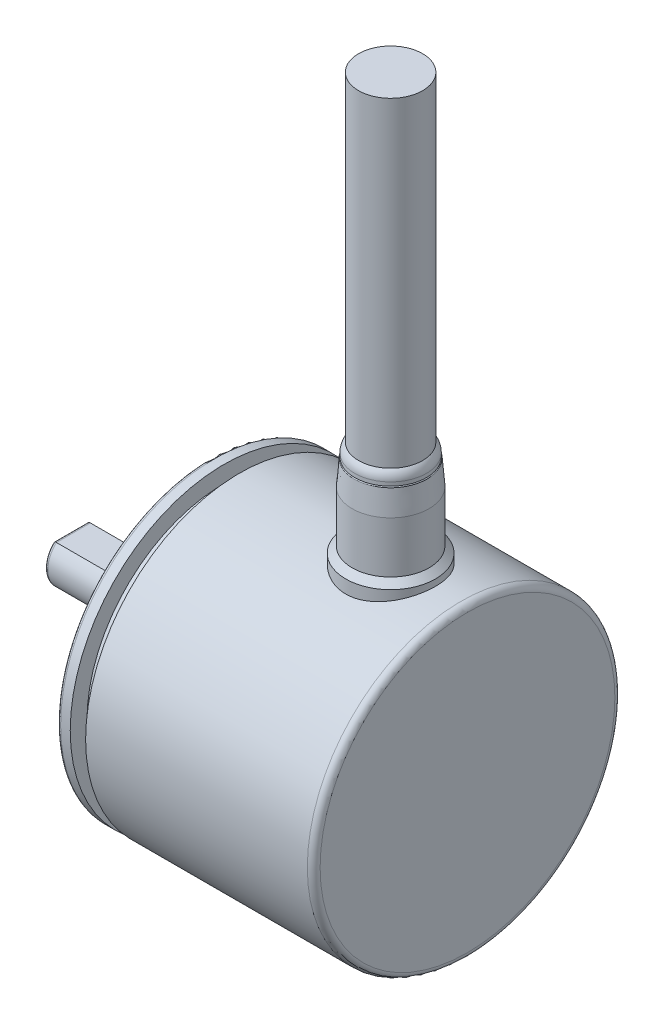
ISO-10303-21;
HEADER;
FILE_DESCRIPTION(('STEP AP214'),'2;1');
FILE_NAME('part.step','',(''),(''),'','','');
FILE_SCHEMA(('AUTOMOTIVE_DESIGN { 1 0 10303 214 1 1 1 1 }'));
ENDSEC;
DATA;
#1=APPLICATION_CONTEXT('core data for automotive mechanical design processes');
#2=APPLICATION_PROTOCOL_DEFINITION('international standard','automotive_design',2000,#1);
#3=PRODUCT_CONTEXT('',#1,'mechanical');
#4=PRODUCT('Part','Part','',(#3));
#5=PRODUCT_RELATED_PRODUCT_CATEGORY('part','',(#4));
#6=PRODUCT_DEFINITION_FORMATION('','',#4);
#7=PRODUCT_DEFINITION_CONTEXT('part definition',#1,'design');
#8=PRODUCT_DEFINITION('design','',#6,#7);
#9=PRODUCT_DEFINITION_SHAPE('','',#8);
#10=(LENGTH_UNIT() NAMED_UNIT(*) SI_UNIT(.MILLI.,.METRE.));
#11=(NAMED_UNIT(*) PLANE_ANGLE_UNIT() SI_UNIT($,.RADIAN.));
#12=(NAMED_UNIT(*) SI_UNIT($,.STERADIAN.) SOLID_ANGLE_UNIT());
#13=UNCERTAINTY_MEASURE_WITH_UNIT(LENGTH_MEASURE(1.E-05),#10,'distance_accuracy_value','');
#14=(GEOMETRIC_REPRESENTATION_CONTEXT(3) GLOBAL_UNCERTAINTY_ASSIGNED_CONTEXT((#13)) GLOBAL_UNIT_ASSIGNED_CONTEXT((#10,
#11,#12)) REPRESENTATION_CONTEXT('',''));
#15=CARTESIAN_POINT('',(0.,0.,0.));
#16=DIRECTION('',(0.,0.,1.));
#17=DIRECTION('',(1.,0.,0.));
#18=AXIS2_PLACEMENT_3D('',#15,#16,#17);
#19=CARTESIAN_POINT('',(0.,0.,0.));
#20=DIRECTION('',(-1.,0.,0.));
#21=DIRECTION('',(0.,0.,1.));
#22=AXIS2_PLACEMENT_3D('',#19,#20,#21);
#23=CYLINDRICAL_SURFACE('',#22,12.);
#24=CARTESIAN_POINT('',(30.5,0.,0.));
#25=DIRECTION('',(-1.,0.,0.));
#26=DIRECTION('',(0.,0.,1.));
#27=AXIS2_PLACEMENT_3D('',#24,#25,#26);
#28=CIRCLE('',#27,12.);
#29=CARTESIAN_POINT('',(30.5,0.,12.));
#30=VERTEX_POINT('',#29);
#31=EDGE_CURVE('E166',#30,#30,#28,.T.);
#32=ORIENTED_EDGE('',*,*,#31,.T.);
#33=EDGE_LOOP('',(#32));
#34=FACE_BOUND('',#33,.T.);
#35=CARTESIAN_POINT('',(13.2,0.,0.));
#36=DIRECTION('',(-1.,0.,0.));
#37=DIRECTION('',(0.,0.,1.));
#38=AXIS2_PLACEMENT_3D('',#35,#36,#37);
#39=CIRCLE('',#38,12.);
#40=CARTESIAN_POINT('',(13.2,0.,12.));
#41=VERTEX_POINT('',#40);
#42=EDGE_CURVE('E110',#41,#41,#39,.T.);
#43=ORIENTED_EDGE('',*,*,#42,.F.);
#44=EDGE_LOOP('',(#43));
#45=FACE_BOUND('',#44,.T.);
#46=CARTESIAN_POINT('',(25.,11.478240283249,-3.5));
#47=CARTESIAN_POINT('',(24.8079456800867,11.4782427046884,-3.49999696286623));
#48=CARTESIAN_POINT('',(24.6158610111039,11.4831132136885,-3.48413840403905));
#49=CARTESIAN_POINT('',(24.2372896890593,11.5019963851738,-3.42127517544508));
#50=CARTESIAN_POINT('',(24.0508051718023,11.5160124904586,-3.37425877640989));
#51=CARTESIAN_POINT('',(23.6889680345196,11.55146732875,-3.25079782037676));
#52=CARTESIAN_POINT('',(23.5135981716306,11.5728942140006,-3.17440021398415));
#53=CARTESIAN_POINT('',(23.1781252420887,11.6207405585869,-2.99449806960499));
#54=CARTESIAN_POINT('',(23.018024188889,11.6471606749995,-2.89098996336001));
#55=CARTESIAN_POINT('',(22.7128447188661,11.7029027600059,-2.65649108658758));
#56=CARTESIAN_POINT('',(22.5682905827767,11.7322839400002,-2.52483193403778));
#57=CARTESIAN_POINT('',(22.3029687593823,11.7901304923972,-2.23920199384477));
#58=CARTESIAN_POINT('',(22.1822039671813,11.8185957529825,-2.08522849455368));
#59=CARTESIAN_POINT('',(21.9656359047095,11.8720727241446,-1.75563543194072));
#60=CARTESIAN_POINT('',(21.8703637304491,11.8970065087208,-1.57965314938519));
#61=CARTESIAN_POINT('',(21.7109661702413,11.9399254638922,-1.21331555166962));
#62=CARTESIAN_POINT('',(21.6468344526689,11.957912046873,-1.02296316740898));
#63=CARTESIAN_POINT('',(21.5532633197028,11.9844911175915,-0.638770652831317));
#64=CARTESIAN_POINT('',(21.522929781359,11.9933252618154,-0.445165306381289));
#65=CARTESIAN_POINT('',(21.4949925219536,12.0014535237492,-0.0554253886246969));
#66=CARTESIAN_POINT('',(21.4973822905699,12.0007495390761,0.140708671835406));
#67=CARTESIAN_POINT('',(21.5342159502416,11.9900533135099,0.523678678020404));
#68=CARTESIAN_POINT('',(21.5676921929043,11.9803414765128,0.710616746520376));
#69=CARTESIAN_POINT('',(21.664172416922,11.9530589644032,1.07609625263408));
#70=CARTESIAN_POINT('',(21.7271782266777,11.935487802663,1.25463716956276));
#71=CARTESIAN_POINT('',(21.8816063493868,11.8940659991905,1.60059838245379));
#72=CARTESIAN_POINT('',(21.9733399792799,11.870147023147,1.76787119601618));
#73=CARTESIAN_POINT('',(22.1823755522204,11.8185773190923,2.08496400151024));
#74=CARTESIAN_POINT('',(22.2996832915972,11.790925745636,2.23478002505818));
#75=CARTESIAN_POINT('',(22.5615873314526,11.7336682134278,2.51848283881575));
#76=CARTESIAN_POINT('',(22.7070237150447,11.7040277595747,2.65158814049178));
#77=CARTESIAN_POINT('',(23.0184484193322,11.6470233620561,2.89173320382773));
#78=CARTESIAN_POINT('',(23.184438554708,11.6196596197574,2.99877066149234));
#79=CARTESIAN_POINT('',(23.5342207719456,11.5701483867438,3.18449757060059));
#80=CARTESIAN_POINT('',(23.7181540625725,11.5480479275493,3.26293452741342));
#81=CARTESIAN_POINT('',(24.0974100361751,11.5121290049895,3.38749702322845));
#82=CARTESIAN_POINT('',(24.2927292218171,11.4983080130282,3.43363242803382));
#83=CARTESIAN_POINT('',(24.681807834367,11.4810637187052,3.49085134441019));
#84=CARTESIAN_POINT('',(24.8753780242385,11.4772898989864,3.50311706489073));
#85=CARTESIAN_POINT('',(25.2618124484049,11.4796005965125,3.49553843290767));
#86=CARTESIAN_POINT('',(25.4546767718123,11.4856838230694,3.47569828440757));
#87=CARTESIAN_POINT('',(25.8293936638332,11.5066805323981,3.40552137026396));
#88=CARTESIAN_POINT('',(26.0113996777462,11.5213772476077,3.35593256227463));
#89=CARTESIAN_POINT('',(26.3645003934711,11.5577237136637,3.22852632632489));
#90=CARTESIAN_POINT('',(26.5355934702298,11.5793744971617,3.15070470568189));
#91=CARTESIAN_POINT('',(26.866855708019,11.6278795698354,2.96675904259822));
#92=CARTESIAN_POINT('',(27.0266327936582,11.6548529411798,2.8599610942228));
#93=CARTESIAN_POINT('',(27.3264304050544,11.7107020318141,2.62190362455645));
#94=CARTESIAN_POINT('',(27.4664464521772,11.7395781801804,2.49063857364422));
#95=CARTESIAN_POINT('',(27.7278493028561,11.7972161348151,2.20183802552396));
#96=CARTESIAN_POINT('',(27.8484014070208,11.8259377249645,2.04353719240707));
#97=CARTESIAN_POINT('',(28.0612427760185,11.8789962420213,1.7082764531468));
#98=CARTESIAN_POINT('',(28.1535334935043,11.9033333942652,1.53131750667089));
#99=CARTESIAN_POINT('',(28.3063455697001,11.9447281109272,1.16496975824715));
#100=CARTESIAN_POINT('',(28.3671066819911,11.9618404220592,0.975687458510751));
#101=CARTESIAN_POINT('',(28.4557746772507,11.987099221746,0.589013781580675));
#102=CARTESIAN_POINT('',(28.4836903995239,11.9952481224826,0.391624600904925));
#103=CARTESIAN_POINT('',(28.5052331514989,12.0015235654755,0.00207487923933942));
#104=CARTESIAN_POINT('',(28.5000740143484,12.0000049173645,-0.1900136814623));
#105=CARTESIAN_POINT('',(28.4584935388594,11.987943356577,-0.570471432028529));
#106=CARTESIAN_POINT('',(28.4220738088263,11.9774009081601,-0.758840812728702));
#107=CARTESIAN_POINT('',(28.3197417952409,11.9485698551566,-1.1247529597905));
#108=CARTESIAN_POINT('',(28.2541178465396,11.9303570722851,-1.30238274255003));
#109=CARTESIAN_POINT('',(28.0954971135166,11.8880729799509,-1.64420678839107));
#110=CARTESIAN_POINT('',(28.0024959784999,11.8640007394272,-1.80839891069818));
#111=CARTESIAN_POINT('',(27.7884469036709,11.8116198660484,-2.12415926367373));
#112=CARTESIAN_POINT('',(27.6666259005302,11.7832039034302,-2.2751855176197));
#113=CARTESIAN_POINT('',(27.3998062621694,11.7257036610685,-2.55505931549893));
#114=CARTESIAN_POINT('',(27.2548011134002,11.6966191954821,-2.68390060541108));
#115=CARTESIAN_POINT('',(26.9409040882468,11.6401313605381,-2.91932045343864));
#116=CARTESIAN_POINT('',(26.7714617035135,11.6127968959886,-3.02518327680785));
#117=CARTESIAN_POINT('',(26.4164116932072,11.5639702791463,-3.2067877796471));
#118=CARTESIAN_POINT('',(26.230812660179,11.5424750461549,-3.28254535203894));
#119=CARTESIAN_POINT('',(25.8721456997171,11.5101147736239,-3.39414253014114));
#120=CARTESIAN_POINT('',(25.7003261240958,11.4982703806005,-3.43373412539387));
#121=CARTESIAN_POINT('',(25.3523457041698,11.4823327007848,-3.48666196340722));
#122=CARTESIAN_POINT('',(25.1761856225924,11.4782380618837,-3.50000278618729));
#123=CARTESIAN_POINT('',(25.,11.478240283249,-3.5));
#124=B_SPLINE_CURVE_WITH_KNOTS('',3,(#46,#47,#48,#49,#50,#51,#52,#53,#54,#55,#56,#57,#58,#59,
#60,#61,#62,#63,#64,#65,#66,#67,#68,#69,#70,#71,#72,#73,#74,#75,#76,#77,#78,#79,#80,#81,#82,#83,
#84,#85,#86,#87,#88,#89,#90,#91,#92,#93,#94,#95,#96,#97,#98,#99,#100,#101,#102,#103,#104,#105,
#106,#107,#108,#109,#110,#111,#112,#113,#114,#115,#116,#117,#118,#119,#120,#121,#122,#123),
.UNSPECIFIED.,.T.,.F.,(4,2,2,2,2,2,2,2,2,2,2,2,2,2,2,2,2,2,2,2,2,2,2,2,2,2,2,2,2,2,2,2,2,2,2,2,
2,2,4),(0.,0.575513594445046,1.15124396228672,1.72605812132359,2.30094797491025,
2.89140733576458,3.48193850972387,4.08395369887512,4.6858464321396,5.27140742237366,
5.85685191658267,6.42466263730568,6.99250852016783,7.56673437126963,8.14109050526404,
8.73642088008381,9.33180385384535,9.93232260704005,10.5326578647985,11.1117566103212,
11.6907795344103,12.2558210221695,12.8209464551607,13.4005475845364,13.980279864273,
14.5805298255139,15.1807489283497,15.7763344482942,16.3717596484225,16.9454613073561,
17.5191334520636,18.0872631970786,18.6554832762436,19.2411395479404,19.8269606489061,
20.4290129483143,21.0307469935459,21.5588002891225,22.0867614461196),.UNSPECIFIED.);
#125=CARTESIAN_POINT('',(25.,11.478240283249,-3.5));
#126=VERTEX_POINT('',#125);
#127=EDGE_CURVE('E125',#126,#126,#124,.T.);
#128=ORIENTED_EDGE('',*,*,#127,.F.);
#129=EDGE_LOOP('',(#128));
#130=FACE_BOUND('',#129,.T.);
#131=ADVANCED_FACE('F40',(#34,#45,#130),#23,.T.);
#132=CARTESIAN_POINT('',(10.,0.,-2.));
#133=DIRECTION('',(1.,0.,0.));
#134=DIRECTION('',(0.,0.,-1.));
#135=AXIS2_PLACEMENT_3D('',#132,#133,#134);
#136=PLANE('',#135);
#137=CARTESIAN_POINT('',(10.,0.,0.));
#138=DIRECTION('',(-1.,0.,0.));
#139=DIRECTION('',(0.,0.,1.));
#140=AXIS2_PLACEMENT_3D('',#137,#138,#139);
#141=CIRCLE('',#140,5.);
#142=CARTESIAN_POINT('',(10.,0.,5.));
#143=VERTEX_POINT('',#142);
#144=EDGE_CURVE('E250',#143,#143,#141,.T.);
#145=ORIENTED_EDGE('',*,*,#144,.F.);
#146=EDGE_LOOP('',(#145));
#147=FACE_BOUND('',#146,.T.);
#148=CARTESIAN_POINT('',(10.,0.,0.));
#149=DIRECTION('',(1.,0.,0.));
#150=DIRECTION('',(0.,0.,-1.));
#151=AXIS2_PLACEMENT_3D('',#148,#149,#150);
#152=CIRCLE('',#151,5.75);
#153=CARTESIAN_POINT('',(10.,0.,-5.75));
#154=VERTEX_POINT('',#153);
#155=EDGE_CURVE('E176',#154,#154,#152,.F.);
#156=ORIENTED_EDGE('',*,*,#155,.T.);
#157=EDGE_LOOP('',(#156));
#158=FACE_BOUND('',#157,.T.);
#159=ADVANCED_FACE('F155',(#147,#158),#136,.F.);
#160=CARTESIAN_POINT('',(0.,0.,0.));
#161=DIRECTION('',(-1.,0.,0.));
#162=DIRECTION('',(0.,0.,1.));
#163=AXIS2_PLACEMENT_3D('',#160,#161,#162);
#164=CYLINDRICAL_SURFACE('',#163,6.);
#165=CARTESIAN_POINT('',(10.25,0.,0.));
#166=DIRECTION('',(1.,0.,0.));
#167=DIRECTION('',(0.,0.,-1.));
#168=AXIS2_PLACEMENT_3D('',#165,#166,#167);
#169=CIRCLE('',#168,6.);
#170=CARTESIAN_POINT('',(10.25,0.,-6.));
#171=VERTEX_POINT('',#170);
#172=EDGE_CURVE('E185',#171,#171,#169,.T.);
#173=ORIENTED_EDGE('',*,*,#172,.T.);
#174=EDGE_LOOP('',(#173));
#175=FACE_BOUND('',#174,.T.);
#176=CARTESIAN_POINT('',(11.,0.,0.));
#177=DIRECTION('',(-1.,0.,0.));
#178=DIRECTION('',(0.,0.,1.));
#179=AXIS2_PLACEMENT_3D('',#176,#177,#178);
#180=CIRCLE('',#179,6.);
#181=CARTESIAN_POINT('',(11.,0.,6.));
#182=VERTEX_POINT('',#181);
#183=EDGE_CURVE('E122',#182,#182,#180,.T.);
#184=ORIENTED_EDGE('',*,*,#183,.T.);
#185=EDGE_LOOP('',(#184));
#186=FACE_BOUND('',#185,.T.);
#187=ADVANCED_FACE('F160',(#175,#186),#164,.T.);
#188=CARTESIAN_POINT('',(11.,0.,-6.));
#189=DIRECTION('',(1.,0.,0.));
#190=DIRECTION('',(0.,0.,-1.));
#191=AXIS2_PLACEMENT_3D('',#188,#189,#190);
#192=PLANE('',#191);
#193=CARTESIAN_POINT('',(11.,-4.50000000000011,-7.79422863405976));
#194=DIRECTION('',(-1.,0.,0.));
#195=DIRECTION('',(0.,0.,1.));
#196=AXIS2_PLACEMENT_3D('',#193,#194,#195);
#197=CIRCLE('',#196,1.50000000000029);
#198=CARTESIAN_POINT('',(11.,-4.50000000000011,-6.29422863405947));
#199=VERTEX_POINT('',#198);
#200=EDGE_CURVE('E274',#199,#199,#197,.T.);
#201=ORIENTED_EDGE('',*,*,#200,.F.);
#202=EDGE_LOOP('',(#201));
#203=FACE_BOUND('',#202,.T.);
#204=CARTESIAN_POINT('',(11.,-4.49999999999989,7.79422863406014));
#205=DIRECTION('',(-1.,0.,0.));
#206=DIRECTION('',(0.,0.,1.));
#207=AXIS2_PLACEMENT_3D('',#204,#205,#206);
#208=CIRCLE('',#207,1.50000000000019);
#209=CARTESIAN_POINT('',(11.,-4.49999999999989,9.29422863406033));
#210=VERTEX_POINT('',#209);
#211=EDGE_CURVE('E268',#210,#210,#208,.T.);
#212=ORIENTED_EDGE('',*,*,#211,.F.);
#213=EDGE_LOOP('',(#212));
#214=FACE_BOUND('',#213,.T.);
#215=CARTESIAN_POINT('',(11.,9.,0.));
#216=DIRECTION('',(-1.,0.,0.));
#217=DIRECTION('',(0.,0.,1.));
#218=AXIS2_PLACEMENT_3D('',#215,#216,#217);
#219=CIRCLE('',#218,1.5);
#220=CARTESIAN_POINT('',(11.,9.,1.5));
#221=VERTEX_POINT('',#220);
#222=EDGE_CURVE('E262',#221,#221,#219,.T.);
#223=ORIENTED_EDGE('',*,*,#222,.F.);
#224=EDGE_LOOP('',(#223));
#225=FACE_BOUND('',#224,.T.);
#226=CARTESIAN_POINT('',(11.,0.,0.));
#227=DIRECTION('',(1.,0.,0.));
#228=DIRECTION('',(0.,0.,-1.));
#229=AXIS2_PLACEMENT_3D('',#226,#227,#228);
#230=CIRCLE('',#229,11.75);
#231=CARTESIAN_POINT('',(11.,0.,-11.75));
#232=VERTEX_POINT('',#231);
#233=EDGE_CURVE('E188',#232,#232,#230,.F.);
#234=ORIENTED_EDGE('',*,*,#233,.T.);
#235=EDGE_LOOP('',(#234));
#236=FACE_BOUND('',#235,.T.);
#237=ORIENTED_EDGE('',*,*,#183,.F.);
#238=EDGE_LOOP('',(#237));
#239=FACE_BOUND('',#238,.T.);
#240=ADVANCED_FACE('F289',(#203,#214,#225,#236,#239),#192,.F.);
#241=CARTESIAN_POINT('',(0.,0.,0.));
#242=DIRECTION('',(-1.,0.,0.));
#243=DIRECTION('',(0.,0.,1.));
#244=AXIS2_PLACEMENT_3D('',#241,#242,#243);
#245=CYLINDRICAL_SURFACE('',#244,12.);
#246=CARTESIAN_POINT('',(11.25,0.,0.));
#247=DIRECTION('',(1.,0.,0.));
#248=DIRECTION('',(0.,0.,-1.));
#249=AXIS2_PLACEMENT_3D('',#246,#247,#248);
#250=CIRCLE('',#249,12.);
#251=CARTESIAN_POINT('',(11.25,0.,-12.));
#252=VERTEX_POINT('',#251);
#253=EDGE_CURVE('E191',#252,#252,#250,.T.);
#254=ORIENTED_EDGE('',*,*,#253,.T.);
#255=EDGE_LOOP('',(#254));
#256=FACE_BOUND('',#255,.T.);
#257=CARTESIAN_POINT('',(12.,0.,0.));
#258=DIRECTION('',(-1.,0.,0.));
#259=DIRECTION('',(0.,0.,1.));
#260=AXIS2_PLACEMENT_3D('',#257,#258,#259);
#261=CIRCLE('',#260,12.);
#262=CARTESIAN_POINT('',(12.,0.,12.));
#263=VERTEX_POINT('',#262);
#264=EDGE_CURVE('E119',#263,#263,#261,.T.);
#265=ORIENTED_EDGE('',*,*,#264,.T.);
#266=EDGE_LOOP('',(#265));
#267=FACE_BOUND('',#266,.T.);
#268=ADVANCED_FACE('F292',(#256,#267),#245,.T.);
#269=CARTESIAN_POINT('',(12.,0.,-10.7));
#270=DIRECTION('',(-1.,0.,0.));
#271=DIRECTION('',(0.,0.,1.));
#272=AXIS2_PLACEMENT_3D('',#269,#270,#271);
#273=PLANE('',#272);
#274=ORIENTED_EDGE('',*,*,#264,.F.);
#275=EDGE_LOOP('',(#274));
#276=FACE_BOUND('',#275,.T.);
#277=CARTESIAN_POINT('',(12.,0.,0.));
#278=DIRECTION('',(-1.,0.,0.));
#279=DIRECTION('',(0.,0.,1.));
#280=AXIS2_PLACEMENT_3D('',#277,#278,#279);
#281=CIRCLE('',#280,10.7);
#282=CARTESIAN_POINT('',(12.,0.,10.7));
#283=VERTEX_POINT('',#282);
#284=EDGE_CURVE('E116',#283,#283,#281,.T.);
#285=ORIENTED_EDGE('',*,*,#284,.T.);
#286=EDGE_LOOP('',(#285));
#287=FACE_BOUND('',#286,.T.);
#288=ADVANCED_FACE('F353',(#276,#287),#273,.F.);
#289=CARTESIAN_POINT('',(0.,0.,0.));
#290=DIRECTION('',(-1.,0.,0.));
#291=DIRECTION('',(0.,0.,1.));
#292=AXIS2_PLACEMENT_3D('',#289,#290,#291);
#293=CYLINDRICAL_SURFACE('',#292,10.7);
#294=ORIENTED_EDGE('',*,*,#284,.F.);
#295=EDGE_LOOP('',(#294));
#296=FACE_BOUND('',#295,.T.);
#297=CARTESIAN_POINT('',(13.2,0.,0.));
#298=DIRECTION('',(-1.,0.,0.));
#299=DIRECTION('',(0.,0.,1.));
#300=AXIS2_PLACEMENT_3D('',#297,#298,#299);
#301=CIRCLE('',#300,10.7);
#302=CARTESIAN_POINT('',(13.2,0.,10.7));
#303=VERTEX_POINT('',#302);
#304=EDGE_CURVE('E113',#303,#303,#301,.T.);
#305=ORIENTED_EDGE('',*,*,#304,.T.);
#306=EDGE_LOOP('',(#305));
#307=FACE_BOUND('',#306,.T.);
#308=ADVANCED_FACE('F151',(#296,#307),#293,.T.);
#309=CARTESIAN_POINT('',(13.2,0.,-12.));
#310=DIRECTION('',(1.,0.,0.));
#311=DIRECTION('',(0.,0.,-1.));
#312=AXIS2_PLACEMENT_3D('',#309,#310,#311);
#313=PLANE('',#312);
#314=ORIENTED_EDGE('',*,*,#304,.F.);
#315=EDGE_LOOP('',(#314));
#316=FACE_BOUND('',#315,.T.);
#317=ORIENTED_EDGE('',*,*,#42,.T.);
#318=EDGE_LOOP('',(#317));
#319=FACE_BOUND('',#318,.T.);
#320=ADVANCED_FACE('F146',(#316,#319),#313,.F.);
#321=CARTESIAN_POINT('',(31.,0.,-12.));
#322=DIRECTION('',(-1.,0.,0.));
#323=DIRECTION('',(0.,0.,1.));
#324=AXIS2_PLACEMENT_3D('',#321,#322,#323);
#325=PLANE('',#324);
#326=CARTESIAN_POINT('',(31.,0.,0.));
#327=DIRECTION('',(-1.,0.,0.));
#328=DIRECTION('',(0.,0.,1.));
#329=AXIS2_PLACEMENT_3D('',#326,#327,#328);
#330=CIRCLE('',#329,11.5);
#331=CARTESIAN_POINT('',(31.,0.,11.5));
#332=VERTEX_POINT('',#331);
#333=EDGE_CURVE('E173',#332,#332,#330,.F.);
#334=ORIENTED_EDGE('',*,*,#333,.T.);
#335=EDGE_LOOP('',(#334));
#336=FACE_BOUND('',#335,.T.);
#337=ADVANCED_FACE('F142',(#336),#325,.F.);
#338=CARTESIAN_POINT('',(25.,13.,0.));
#339=DIRECTION('',(0.,-1.,0.));
#340=DIRECTION('',(0.,0.,-1.));
#341=AXIS2_PLACEMENT_3D('',#338,#339,#340);
#342=CYLINDRICAL_SURFACE('',#341,3.5);
#343=CARTESIAN_POINT('',(25.,12.5,0.));
#344=DIRECTION('',(0.,1.,0.));
#345=DIRECTION('',(0.,0.,1.));
#346=AXIS2_PLACEMENT_3D('',#343,#344,#345);
#347=CIRCLE('',#346,3.5);
#348=CARTESIAN_POINT('',(25.,12.5,3.5));
#349=VERTEX_POINT('',#348);
#350=EDGE_CURVE('E132',#349,#349,#347,.F.);
#351=ORIENTED_EDGE('',*,*,#350,.T.);
#352=EDGE_LOOP('',(#351));
#353=FACE_BOUND('',#352,.T.);
#354=ORIENTED_EDGE('',*,*,#127,.T.);
#355=EDGE_LOOP('',(#354));
#356=FACE_BOUND('',#355,.T.);
#357=ADVANCED_FACE('F137',(#353,#356),#342,.T.);
#358=CARTESIAN_POINT('',(25.,19.,0.));
#359=DIRECTION('',(0.,-1.,0.));
#360=DIRECTION('',(0.,0.,-1.));
#361=AXIS2_PLACEMENT_3D('',#358,#359,#360);
#362=CYLINDRICAL_SURFACE('',#361,3.);
#363=CARTESIAN_POINT('',(25.,17.0000000000004,0.));
#364=DIRECTION('',(0.,1.,0.));
#365=DIRECTION('',(0.,0.,1.));
#366=AXIS2_PLACEMENT_3D('',#363,#364,#365);
#367=CIRCLE('',#366,3.);
#368=CARTESIAN_POINT('',(25.,17.0000000000004,3.));
#369=VERTEX_POINT('',#368);
#370=EDGE_CURVE('E723',#369,#369,#367,.F.);
#371=ORIENTED_EDGE('',*,*,#370,.T.);
#372=EDGE_LOOP('',(#371));
#373=FACE_BOUND('',#372,.T.);
#374=CARTESIAN_POINT('',(25.,13.,0.));
#375=DIRECTION('',(0.,1.,0.));
#376=DIRECTION('',(0.,0.,1.));
#377=AXIS2_PLACEMENT_3D('',#374,#375,#376);
#378=CIRCLE('',#377,3.);
#379=CARTESIAN_POINT('',(25.,13.,3.));
#380=VERTEX_POINT('',#379);
#381=EDGE_CURVE('E107',#380,#380,#378,.T.);
#382=ORIENTED_EDGE('',*,*,#381,.T.);
#383=EDGE_LOOP('',(#382));
#384=FACE_BOUND('',#383,.T.);
#385=ADVANCED_FACE('F141',(#373,#384),#362,.T.);
#386=CARTESIAN_POINT('',(25.,20.,0.));
#387=DIRECTION('',(0.,-1.,0.));
#388=DIRECTION('',(0.,0.,-1.));
#389=AXIS2_PLACEMENT_3D('',#386,#387,#388);
#390=CYLINDRICAL_SURFACE('',#389,2.8);
#391=CARTESIAN_POINT('',(25.,19.2858571571457,0.));
#392=DIRECTION('',(0.,1.,0.));
#393=DIRECTION('',(0.,0.,1.));
#394=AXIS2_PLACEMENT_3D('',#391,#392,#393);
#395=CIRCLE('',#394,2.8);
#396=CARTESIAN_POINT('',(25.,19.2858571571457,2.8));
#397=VERTEX_POINT('',#396);
#398=EDGE_CURVE('E179',#397,#397,#395,.F.);
#399=ORIENTED_EDGE('',*,*,#398,.T.);
#400=EDGE_LOOP('',(#399));
#401=FACE_BOUND('',#400,.T.);
#402=CARTESIAN_POINT('',(25.,19.,0.));
#403=DIRECTION('',(0.,1.,0.));
#404=DIRECTION('',(0.,0.,1.));
#405=AXIS2_PLACEMENT_3D('',#402,#403,#404);
#406=CIRCLE('',#405,2.8);
#407=CARTESIAN_POINT('',(25.,19.,2.8));
#408=VERTEX_POINT('',#407);
#409=EDGE_CURVE('E102',#408,#408,#406,.T.);
#410=ORIENTED_EDGE('',*,*,#409,.T.);
#411=EDGE_LOOP('',(#410));
#412=FACE_BOUND('',#411,.T.);
#413=ADVANCED_FACE('F393',(#401,#412),#390,.T.);
#414=CARTESIAN_POINT('',(25.,45.,0.));
#415=DIRECTION('',(0.,-1.,0.));
#416=DIRECTION('',(0.,0.,-1.));
#417=AXIS2_PLACEMENT_3D('',#414,#415,#416);
#418=CYLINDRICAL_SURFACE('',#417,2.5);
#419=CARTESIAN_POINT('',(25.,45.,0.));
#420=DIRECTION('',(0.,1.,0.));
#421=DIRECTION('',(0.,0.,1.));
#422=AXIS2_PLACEMENT_3D('',#419,#420,#421);
#423=CIRCLE('',#422,2.5);
#424=CARTESIAN_POINT('',(25.,45.,2.5));
#425=VERTEX_POINT('',#424);
#426=EDGE_CURVE('E99',#425,#425,#423,.T.);
#427=ORIENTED_EDGE('',*,*,#426,.F.);
#428=EDGE_LOOP('',(#427));
#429=FACE_BOUND('',#428,.T.);
#430=CARTESIAN_POINT('',(25.,20.,0.));
#431=DIRECTION('',(0.,1.,0.));
#432=DIRECTION('',(0.,0.,1.));
#433=AXIS2_PLACEMENT_3D('',#430,#431,#432);
#434=CIRCLE('',#433,2.5);
#435=CARTESIAN_POINT('',(25.,20.,2.5));
#436=VERTEX_POINT('',#435);
#437=EDGE_CURVE('E96',#436,#436,#434,.T.);
#438=ORIENTED_EDGE('',*,*,#437,.T.);
#439=EDGE_LOOP('',(#438));
#440=FACE_BOUND('',#439,.T.);
#441=ADVANCED_FACE('F383',(#429,#440),#418,.T.);
#442=CARTESIAN_POINT('',(25.,45.,0.));
#443=DIRECTION('',(0.,1.,0.));
#444=DIRECTION('',(0.,0.,1.));
#445=AXIS2_PLACEMENT_3D('',#442,#443,#444);
#446=PLANE('',#445);
#447=ORIENTED_EDGE('',*,*,#426,.T.);
#448=EDGE_LOOP('',(#447));
#449=FACE_BOUND('',#448,.T.);
#450=ADVANCED_FACE('F318',(#449),#446,.T.);
#451=CARTESIAN_POINT('',(25.,13.,0.));
#452=DIRECTION('',(0.,-1.,0.));
#453=DIRECTION('',(0.,0.,-1.));
#454=AXIS2_PLACEMENT_3D('',#451,#452,#453);
#455=CONICAL_SURFACE('',#454,3.00000000000004,0.785398163397443);
#456=ORIENTED_EDGE('',*,*,#350,.F.);
#457=EDGE_LOOP('',(#456));
#458=FACE_BOUND('',#457,.T.);
#459=ORIENTED_EDGE('',*,*,#381,.F.);
#460=EDGE_LOOP('',(#459));
#461=FACE_BOUND('',#460,.T.);
#462=ADVANCED_FACE('F314',(#458,#461),#455,.T.);
#463=CARTESIAN_POINT('',(25.,19.,0.));
#464=DIRECTION('',(0.,-1.,0.));
#465=DIRECTION('',(0.,0.,-1.));
#466=AXIS2_PLACEMENT_3D('',#463,#464,#465);
#467=CONICAL_SURFACE('',#466,2.84000000000004,0.0798299857122337);
#468=CARTESIAN_POINT('',(25.,18.9235298234866,0.));
#469=DIRECTION('',(0.,-1.,0.));
#470=DIRECTION('',(0.,0.,-1.));
#471=AXIS2_PLACEMENT_3D('',#468,#469,#470);
#472=CIRCLE('',#471,2.84611761412111);
#473=CARTESIAN_POINT('',(25.,18.9235298234866,-2.84611761412111));
#474=VERTEX_POINT('',#473);
#475=EDGE_CURVE('E174',#474,#474,#472,.T.);
#476=ORIENTED_EDGE('',*,*,#475,.T.);
#477=EDGE_LOOP('',(#476));
#478=FACE_BOUND('',#477,.T.);
#479=ORIENTED_EDGE('',*,*,#370,.F.);
#480=EDGE_LOOP('',(#479));
#481=FACE_BOUND('',#480,.T.);
#482=ADVANCED_FACE('F317',(#478,#481),#467,.T.);
#483=CARTESIAN_POINT('',(25.,19.2858571571457,0.));
#484=DIRECTION('',(0.,1.,0.));
#485=DIRECTION('',(0.,0.,1.));
#486=AXIS2_PLACEMENT_3D('',#483,#484,#485);
#487=TOROIDAL_SURFACE('',#486,1.8,1.);
#488=ORIENTED_EDGE('',*,*,#398,.F.);
#489=EDGE_LOOP('',(#488));
#490=FACE_BOUND('',#489,.T.);
#491=ORIENTED_EDGE('',*,*,#437,.F.);
#492=EDGE_LOOP('',(#491));
#493=FACE_BOUND('',#492,.T.);
#494=ADVANCED_FACE('F322',(#490,#493),#487,.T.);
#495=CARTESIAN_POINT('',(25.,18.9155553012583,0.));
#496=DIRECTION('',(0.,1.,0.));
#497=DIRECTION('',(0.,0.,1.));
#498=AXIS2_PLACEMENT_3D('',#495,#496,#497);
#499=TOROIDAL_SURFACE('',#498,2.7464360862675,0.1);
#500=ORIENTED_EDGE('',*,*,#475,.F.);
#501=EDGE_LOOP('',(#500));
#502=FACE_BOUND('',#501,.T.);
#503=ORIENTED_EDGE('',*,*,#409,.F.);
#504=EDGE_LOOP('',(#503));
#505=FACE_BOUND('',#504,.T.);
#506=ADVANCED_FACE('F326',(#502,#505),#499,.T.);
#507=CARTESIAN_POINT('',(30.5,0.,0.));
#508=DIRECTION('',(-1.,0.,0.));
#509=DIRECTION('',(0.,0.,1.));
#510=AXIS2_PLACEMENT_3D('',#507,#508,#509);
#511=TOROIDAL_SURFACE('',#510,11.5,0.5);
#512=ORIENTED_EDGE('',*,*,#333,.F.);
#513=EDGE_LOOP('',(#512));
#514=FACE_BOUND('',#513,.T.);
#515=ORIENTED_EDGE('',*,*,#31,.F.);
#516=EDGE_LOOP('',(#515));
#517=FACE_BOUND('',#516,.T.);
#518=ADVANCED_FACE('F330',(#514,#517),#511,.T.);
#519=CARTESIAN_POINT('',(10.25,0.,0.));
#520=DIRECTION('',(1.,0.,0.));
#521=DIRECTION('',(0.,0.,-1.));
#522=AXIS2_PLACEMENT_3D('',#519,#520,#521);
#523=TOROIDAL_SURFACE('',#522,5.75,0.25);
#524=ORIENTED_EDGE('',*,*,#172,.F.);
#525=EDGE_LOOP('',(#524));
#526=FACE_BOUND('',#525,.T.);
#527=ORIENTED_EDGE('',*,*,#155,.F.);
#528=EDGE_LOOP('',(#527));
#529=FACE_BOUND('',#528,.T.);
#530=ADVANCED_FACE('F334',(#526,#529),#523,.T.);
#531=CARTESIAN_POINT('',(11.25,0.,0.));
#532=DIRECTION('',(1.,0.,0.));
#533=DIRECTION('',(0.,0.,-1.));
#534=AXIS2_PLACEMENT_3D('',#531,#532,#533);
#535=TOROIDAL_SURFACE('',#534,11.75,0.25);
#536=ORIENTED_EDGE('',*,*,#253,.F.);
#537=EDGE_LOOP('',(#536));
#538=FACE_BOUND('',#537,.T.);
#539=ORIENTED_EDGE('',*,*,#233,.F.);
#540=EDGE_LOOP('',(#539));
#541=FACE_BOUND('',#540,.T.);
#542=ADVANCED_FACE('F337',(#538,#541),#535,.T.);
#543=CARTESIAN_POINT('',(10.25,0.,0.));
#544=DIRECTION('',(-1.,0.,0.));
#545=DIRECTION('',(0.,0.,1.));
#546=AXIS2_PLACEMENT_3D('',#543,#544,#545);
#547=CYLINDRICAL_SURFACE('',#546,5.);
#548=CARTESIAN_POINT('',(10.25,0.,0.));
#549=DIRECTION('',(-1.,0.,0.));
#550=DIRECTION('',(0.,0.,1.));
#551=AXIS2_PLACEMENT_3D('',#548,#549,#550);
#552=CIRCLE('',#551,5.);
#553=CARTESIAN_POINT('',(10.25,0.,5.));
#554=VERTEX_POINT('',#553);
#555=EDGE_CURVE('E247',#554,#554,#552,.T.);
#556=ORIENTED_EDGE('',*,*,#555,.F.);
#557=EDGE_LOOP('',(#556));
#558=FACE_BOUND('',#557,.T.);
#559=ORIENTED_EDGE('',*,*,#144,.T.);
#560=EDGE_LOOP('',(#559));
#561=FACE_BOUND('',#560,.T.);
#562=ADVANCED_FACE('F340',(#558,#561),#547,.F.);
#563=CARTESIAN_POINT('',(10.25,-12.7914213562373,0.));
#564=DIRECTION('',(-1.,0.,0.));
#565=DIRECTION('',(0.,0.,1.));
#566=AXIS2_PLACEMENT_3D('',#563,#564,#565);
#567=PLANE('',#566);
#568=CARTESIAN_POINT('',(10.25,0.,0.));
#569=DIRECTION('',(-1.,0.,0.));
#570=DIRECTION('',(0.,0.,1.));
#571=AXIS2_PLACEMENT_3D('',#568,#569,#570);
#572=CIRCLE('',#571,4.125);
#573=CARTESIAN_POINT('',(10.25,0.,4.125));
#574=VERTEX_POINT('',#573);
#575=EDGE_CURVE('E236',#574,#574,#572,.F.);
#576=ORIENTED_EDGE('',*,*,#575,.T.);
#577=EDGE_LOOP('',(#576));
#578=FACE_BOUND('',#577,.T.);
#579=ORIENTED_EDGE('',*,*,#555,.T.);
#580=EDGE_LOOP('',(#579));
#581=FACE_BOUND('',#580,.T.);
#582=ADVANCED_FACE('F345',(#578,#581),#567,.T.);
#583=CARTESIAN_POINT('',(10.5,0.,0.));
#584=DIRECTION('',(-1.,0.,0.));
#585=DIRECTION('',(0.,0.,1.));
#586=AXIS2_PLACEMENT_3D('',#583,#584,#585);
#587=CYLINDRICAL_SURFACE('',#586,4.);
#588=CARTESIAN_POINT('',(10.375,0.,0.));
#589=DIRECTION('',(-1.,0.,0.));
#590=DIRECTION('',(0.,0.,1.));
#591=AXIS2_PLACEMENT_3D('',#588,#589,#590);
#592=CIRCLE('',#591,4.);
#593=CARTESIAN_POINT('',(10.375,0.,4.));
#594=VERTEX_POINT('',#593);
#595=EDGE_CURVE('E200',#594,#594,#592,.T.);
#596=ORIENTED_EDGE('',*,*,#595,.T.);
#597=EDGE_LOOP('',(#596));
#598=FACE_BOUND('',#597,.T.);
#599=CARTESIAN_POINT('',(10.5,0.,0.));
#600=DIRECTION('',(-1.,0.,0.));
#601=DIRECTION('',(0.,0.,1.));
#602=AXIS2_PLACEMENT_3D('',#599,#600,#601);
#603=CIRCLE('',#602,4.);
#604=CARTESIAN_POINT('',(10.5,0.,4.));
#605=VERTEX_POINT('',#604);
#606=EDGE_CURVE('E254',#605,#605,#603,.T.);
#607=ORIENTED_EDGE('',*,*,#606,.F.);
#608=EDGE_LOOP('',(#607));
#609=FACE_BOUND('',#608,.T.);
#610=ADVANCED_FACE('F547',(#598,#609),#587,.F.);
#611=CARTESIAN_POINT('',(10.5,0.,0.));
#612=DIRECTION('',(-1.,0.,0.));
#613=DIRECTION('',(0.,0.,1.));
#614=AXIS2_PLACEMENT_3D('',#611,#612,#613);
#615=PLANE('',#614);
#616=CARTESIAN_POINT('',(10.5,0.,0.));
#617=DIRECTION('',(-1.,0.,0.));
#618=DIRECTION('',(0.,0.,1.));
#619=AXIS2_PLACEMENT_3D('',#616,#617,#618);
#620=CIRCLE('',#619,3.);
#621=CARTESIAN_POINT('',(10.5,0.,3.));
#622=VERTEX_POINT('',#621);
#623=EDGE_CURVE('E258',#622,#622,#620,.T.);
#624=ORIENTED_EDGE('',*,*,#623,.F.);
#625=EDGE_LOOP('',(#624));
#626=FACE_BOUND('',#625,.T.);
#627=ORIENTED_EDGE('',*,*,#606,.T.);
#628=EDGE_LOOP('',(#627));
#629=FACE_BOUND('',#628,.T.);
#630=ADVANCED_FACE('F539',(#626,#629),#615,.T.);
#631=CARTESIAN_POINT('',(10.5,0.,0.));
#632=DIRECTION('',(-1.,0.,0.));
#633=DIRECTION('',(0.,0.,1.));
#634=AXIS2_PLACEMENT_3D('',#631,#632,#633);
#635=CYLINDRICAL_SURFACE('',#634,3.);
#636=CARTESIAN_POINT('',(10.375,0.,0.));
#637=DIRECTION('',(-1.,0.,0.));
#638=DIRECTION('',(0.,0.,1.));
#639=AXIS2_PLACEMENT_3D('',#636,#637,#638);
#640=CIRCLE('',#639,3.);
#641=CARTESIAN_POINT('',(10.375,0.,3.));
#642=VERTEX_POINT('',#641);
#643=EDGE_CURVE('E12',#642,#642,#640,.F.);
#644=ORIENTED_EDGE('',*,*,#643,.T.);
#645=EDGE_LOOP('',(#644));
#646=FACE_BOUND('',#645,.T.);
#647=ORIENTED_EDGE('',*,*,#623,.T.);
#648=EDGE_LOOP('',(#647));
#649=FACE_BOUND('',#648,.T.);
#650=ADVANCED_FACE('F313',(#646,#649),#635,.T.);
#651=CARTESIAN_POINT('',(0.,0.,0.));
#652=DIRECTION('',(1.,0.,0.));
#653=DIRECTION('',(0.,0.,-1.));
#654=AXIS2_PLACEMENT_3D('',#651,#652,#653);
#655=PLANE('',#654);
#656=CARTESIAN_POINT('',(0.,0.,0.));
#657=DIRECTION('',(1.,0.,0.));
#658=DIRECTION('',(0.,0.,-1.));
#659=AXIS2_PLACEMENT_3D('',#656,#657,#658);
#660=CIRCLE('',#659,1.75);
#661=CARTESIAN_POINT('',(0.,1.24999999999921,-1.22474487139239));
#662=VERTEX_POINT('',#661);
#663=CARTESIAN_POINT('',(0.,1.24999999999921,1.22474487139239));
#664=VERTEX_POINT('',#663);
#665=EDGE_CURVE('E54',#662,#664,#660,.F.);
#666=ORIENTED_EDGE('',*,*,#665,.T.);
#667=DIRECTION('',(0.,0.,1.));
#668=VECTOR('',#667,1.);
#669=CARTESIAN_POINT('',(0.,1.25,0.));
#670=LINE('',#669,#668);
#671=EDGE_CURVE('E197',#664,#662,#670,.F.);
#672=ORIENTED_EDGE('',*,*,#671,.T.);
#673=EDGE_LOOP('',(#666,#672));
#674=FACE_BOUND('',#673,.T.);
#675=ADVANCED_FACE('F219',(#674),#655,.F.);
#676=CARTESIAN_POINT('',(0.25,1.25,-1.3228756555323));
#677=DIRECTION('',(0.,0.,1.));
#678=DIRECTION('',(1.,0.,0.));
#679=AXIS2_PLACEMENT_3D('',#676,#677,#678);
#680=CYLINDRICAL_SURFACE('',#679,0.25);
#681=CARTESIAN_POINT('',(0.25,1.5,-1.3228756555323));
#682=CARTESIAN_POINT('',(0.236601760667162,1.50001460787941,-1.32288043942927));
#683=CARTESIAN_POINT('',(0.223212051626806,1.49892391777188,-1.32246892663244));
#684=CARTESIAN_POINT('',(0.196853674647384,1.49464524935072,-1.32085064101542));
#685=CARTESIAN_POINT('',(0.183884061068799,1.49146238318972,-1.31964580663411));
#686=CARTESIAN_POINT('',(0.158702532481794,1.48311218348259,-1.31647807766724));
#687=CARTESIAN_POINT('',(0.146490526012006,1.47794509002397,-1.31451527479418));
#688=CARTESIAN_POINT('',(0.123134101444518,1.46581969869838,-1.3098950548356));
#689=CARTESIAN_POINT('',(0.111989958492959,1.45886094088421,-1.30723745938367));
#690=CARTESIAN_POINT('',(0.090760300015876,1.44318719702933,-1.30122881024574));
#691=CARTESIAN_POINT('',(0.0807092792530267,1.43443173434541,-1.29786171477706));
#692=CARTESIAN_POINT('',(0.0622130415175285,1.41556188140365,-1.29057163987912));
#693=CARTESIAN_POINT('',(0.0537683594152745,1.4054470404135,-1.28664847604926));
#694=CARTESIAN_POINT('',(0.0381720310806528,1.38349585727951,-1.2780904692004));
#695=CARTESIAN_POINT('',(0.0311314292897456,1.37159198545756,-1.27342673744297));
#696=CARTESIAN_POINT('',(0.0191446411730361,1.34692205802764,-1.26370315417488));
#697=CARTESIAN_POINT('',(0.0141988340652632,1.33415584679605,-1.25864323113849));
#698=CARTESIAN_POINT('',(0.00705783414515641,1.31009767186742,-1.24904647270932));
#699=CARTESIAN_POINT('',(0.00455753549568116,1.2988790677508,-1.24454808435023));
#700=CARTESIAN_POINT('',(0.00112204372139481,1.27626960286654,-1.23543121828065));
#701=CARTESIAN_POINT('',(0.000183981763856552,1.26487909669024,-1.23081297654509));
#702=CARTESIAN_POINT('',(8.14721404905323E-06,1.25233312672412,-1.22569709047829));
#703=CARTESIAN_POINT('',(-1.96826759251744E-08,1.25116644581299,-1.22522107311834));
#704=CARTESIAN_POINT('',(0.,1.25,-1.22474487139159));
#705=B_SPLINE_CURVE_WITH_KNOTS('',3,(#681,#682,#683,#684,#685,#686,#687,#688,#689,#690,#691,
#692,#693,#694,#695,#696,#697,#698,#699,#700,#701,#702,#703,#704),.UNSPECIFIED.,.F.,.F.,(4,2,2,
2,2,2,2,2,2,2,2,4),(0.,0.0401309427212086,0.0801641897123573,0.12019259428663,0.160231285017948,
0.201297188863015,0.242376742777164,0.285975335064152,0.329581816579232,0.366515158141394,
0.403380601613963,0.407160719471771),.UNSPECIFIED.);
#706=CARTESIAN_POINT('',(0.25,1.5,-1.3228756555323));
#707=VERTEX_POINT('',#706);
#708=EDGE_CURVE('E61',#707,#662,#705,.T.);
#709=ORIENTED_EDGE('',*,*,#708,.T.);
#710=ORIENTED_EDGE('',*,*,#671,.F.);
#711=CARTESIAN_POINT('',(0.25,1.5,1.3228756555323));
#712=CARTESIAN_POINT('',(0.236601760667162,1.50001460787941,1.32288043942927));
#713=CARTESIAN_POINT('',(0.223212051626806,1.49892391777188,1.32246892663244));
#714=CARTESIAN_POINT('',(0.196853674647384,1.49464524935072,1.32085064101542));
#715=CARTESIAN_POINT('',(0.183884061068799,1.49146238318972,1.31964580663411));
#716=CARTESIAN_POINT('',(0.158702532481794,1.48311218348259,1.31647807766724));
#717=CARTESIAN_POINT('',(0.146490526012006,1.47794509002397,1.31451527479418));
#718=CARTESIAN_POINT('',(0.123134101444518,1.46581969869838,1.3098950548356));
#719=CARTESIAN_POINT('',(0.111989958492959,1.45886094088421,1.30723745938367));
#720=CARTESIAN_POINT('',(0.090760300015876,1.44318719702933,1.30122881024574));
#721=CARTESIAN_POINT('',(0.0807092792530267,1.43443173434541,1.29786171477706));
#722=CARTESIAN_POINT('',(0.0622130415175285,1.41556188140365,1.29057163987912));
#723=CARTESIAN_POINT('',(0.0537683594152745,1.4054470404135,1.28664847604926));
#724=CARTESIAN_POINT('',(0.0381720310806528,1.38349585727951,1.2780904692004));
#725=CARTESIAN_POINT('',(0.0311314292897456,1.37159198545756,1.27342673744297));
#726=CARTESIAN_POINT('',(0.0191446411730361,1.34692205802764,1.26370315417488));
#727=CARTESIAN_POINT('',(0.0141988340652632,1.33415584679605,1.25864323113849));
#728=CARTESIAN_POINT('',(0.00705783414515641,1.31009767186742,1.24904647270932));
#729=CARTESIAN_POINT('',(0.00455753549568116,1.2988790677508,1.24454808435023));
#730=CARTESIAN_POINT('',(0.00112204372139481,1.27626960286654,1.23543121828065));
#731=CARTESIAN_POINT('',(0.000183981763856552,1.26487909669024,1.23081297654509));
#732=CARTESIAN_POINT('',(8.14721404905323E-06,1.25233312672412,1.22569709047829));
#733=CARTESIAN_POINT('',(-1.96826759251744E-08,1.25116644581299,1.22522107311834));
#734=CARTESIAN_POINT('',(0.,1.25,1.22474487139159));
#735=B_SPLINE_CURVE_WITH_KNOTS('',3,(#711,#712,#713,#714,#715,#716,#717,#718,#719,#720,#721,
#722,#723,#724,#725,#726,#727,#728,#729,#730,#731,#732,#733,#734),.UNSPECIFIED.,.F.,.F.,(4,2,2,
2,2,2,2,2,2,2,2,4),(0.,0.0401309427212086,0.0801641897123573,0.12019259428663,0.160231285017948,
0.201297188863015,0.242376742777164,0.285975335064152,0.329581816579232,0.366515158141394,
0.403380601613963,0.407160719471771),.UNSPECIFIED.);
#736=CARTESIAN_POINT('',(0.25,1.5,1.3228756555323));
#737=VERTEX_POINT('',#736);
#738=EDGE_CURVE('E201',#664,#737,#735,.F.);
#739=ORIENTED_EDGE('',*,*,#738,.T.);
#740=DIRECTION('',(0.,0.,1.));
#741=VECTOR('',#740,1.);
#742=CARTESIAN_POINT('',(0.25,1.5,-1.3228756555323));
#743=LINE('',#742,#741);
#744=EDGE_CURVE('E194',#707,#737,#743,.T.);
#745=ORIENTED_EDGE('',*,*,#744,.F.);
#746=EDGE_LOOP('',(#709,#710,#739,#745));
#747=FACE_BOUND('',#746,.T.);
#748=ADVANCED_FACE('F216',(#747),#680,.T.);
#749=CARTESIAN_POINT('',(8.5,0.,0.));
#750=DIRECTION('',(1.,0.,0.));
#751=DIRECTION('',(0.,0.,-1.));
#752=AXIS2_PLACEMENT_3D('',#749,#750,#751);
#753=PLANE('',#752);
#754=CARTESIAN_POINT('',(8.5,0.,0.));
#755=DIRECTION('',(-1.,0.,0.));
#756=DIRECTION('',(0.,0.,-1.));
#757=AXIS2_PLACEMENT_3D('',#754,#755,#756);
#758=CIRCLE('',#757,2.);
#759=CARTESIAN_POINT('',(8.5,1.5,1.3228756555323));
#760=VERTEX_POINT('',#759);
#761=CARTESIAN_POINT('',(8.5,1.5,-1.3228756555323));
#762=VERTEX_POINT('',#761);
#763=EDGE_CURVE('E75',#760,#762,#758,.T.);
#764=ORIENTED_EDGE('',*,*,#763,.T.);
#765=DIRECTION('',(0.,0.,1.));
#766=VECTOR('',#765,1.);
#767=CARTESIAN_POINT('',(8.5,1.5,-1.3228756555323));
#768=LINE('',#767,#766);
#769=EDGE_CURVE('E78',#762,#760,#768,.T.);
#770=ORIENTED_EDGE('',*,*,#769,.T.);
#771=EDGE_LOOP('',(#764,#770));
#772=FACE_BOUND('',#771,.T.);
#773=ADVANCED_FACE('F77',(#772),#753,.F.);
#774=CARTESIAN_POINT('',(0.25,0.,0.));
#775=DIRECTION('',(1.,0.,0.));
#776=DIRECTION('',(0.,0.,-1.));
#777=AXIS2_PLACEMENT_3D('',#774,#775,#776);
#778=TOROIDAL_SURFACE('',#777,1.75,0.25);
#779=ORIENTED_EDGE('',*,*,#738,.F.);
#780=ORIENTED_EDGE('',*,*,#665,.F.);
#781=ORIENTED_EDGE('',*,*,#708,.F.);
#782=CARTESIAN_POINT('',(0.25,0.,0.));
#783=DIRECTION('',(1.,0.,0.));
#784=DIRECTION('',(0.,0.,-1.));
#785=AXIS2_PLACEMENT_3D('',#782,#783,#784);
#786=CIRCLE('',#785,2.);
#787=EDGE_CURVE('E94',#737,#707,#786,.T.);
#788=ORIENTED_EDGE('',*,*,#787,.F.);
#789=EDGE_LOOP('',(#779,#780,#781,#788));
#790=FACE_BOUND('',#789,.T.);
#791=ADVANCED_FACE('F213',(#790),#778,.T.);
#792=CARTESIAN_POINT('',(8.5,1.5,-1.3228756555323));
#793=DIRECTION('',(0.,-1.,0.));
#794=DIRECTION('',(0.,0.,-1.));
#795=AXIS2_PLACEMENT_3D('',#792,#793,#794);
#796=PLANE('',#795);
#797=DIRECTION('',(-1.,0.,0.));
#798=VECTOR('',#797,1.);
#799=CARTESIAN_POINT('',(8.5,1.5,-1.3228756555323));
#800=LINE('',#799,#798);
#801=EDGE_CURVE('E88',#762,#707,#800,.T.);
#802=ORIENTED_EDGE('',*,*,#801,.T.);
#803=ORIENTED_EDGE('',*,*,#744,.T.);
#804=DIRECTION('',(-1.,0.,0.));
#805=VECTOR('',#804,1.);
#806=CARTESIAN_POINT('',(8.5,1.5,1.3228756555323));
#807=LINE('',#806,#805);
#808=EDGE_CURVE('E89',#760,#737,#807,.T.);
#809=ORIENTED_EDGE('',*,*,#808,.F.);
#810=ORIENTED_EDGE('',*,*,#769,.F.);
#811=EDGE_LOOP('',(#802,#803,#809,#810));
#812=FACE_BOUND('',#811,.T.);
#813=ADVANCED_FACE('F86',(#812),#796,.F.);
#814=CARTESIAN_POINT('',(0.,0.,0.));
#815=DIRECTION('',(-1.,0.,0.));
#816=DIRECTION('',(0.,0.,1.));
#817=AXIS2_PLACEMENT_3D('',#814,#815,#816);
#818=CYLINDRICAL_SURFACE('',#817,2.);
#819=ORIENTED_EDGE('',*,*,#808,.T.);
#820=ORIENTED_EDGE('',*,*,#787,.T.);
#821=ORIENTED_EDGE('',*,*,#801,.F.);
#822=ORIENTED_EDGE('',*,*,#763,.F.);
#823=EDGE_LOOP('',(#819,#820,#821,#822));
#824=FACE_BOUND('',#823,.T.);
#825=CARTESIAN_POINT('',(10.25,0.,0.));
#826=DIRECTION('',(-1.,0.,0.));
#827=DIRECTION('',(0.,0.,1.));
#828=AXIS2_PLACEMENT_3D('',#825,#826,#827);
#829=CIRCLE('',#828,2.);
#830=CARTESIAN_POINT('',(10.25,0.,2.));
#831=VERTEX_POINT('',#830);
#832=EDGE_CURVE('E208',#831,#831,#829,.F.);
#833=ORIENTED_EDGE('',*,*,#832,.F.);
#834=EDGE_LOOP('',(#833));
#835=FACE_BOUND('',#834,.T.);
#836=ADVANCED_FACE('F91',(#824,#835),#818,.T.);
#837=CARTESIAN_POINT('',(10.25,-12.7914213562373,0.));
#838=DIRECTION('',(-1.,0.,0.));
#839=DIRECTION('',(0.,0.,1.));
#840=AXIS2_PLACEMENT_3D('',#837,#838,#839);
#841=PLANE('',#840);
#842=CARTESIAN_POINT('',(10.25,0.,0.));
#843=DIRECTION('',(-1.,0.,0.));
#844=DIRECTION('',(0.,0.,1.));
#845=AXIS2_PLACEMENT_3D('',#842,#843,#844);
#846=CIRCLE('',#845,2.875);
#847=CARTESIAN_POINT('',(10.25,0.,2.875));
#848=VERTEX_POINT('',#847);
#849=EDGE_CURVE('E48',#848,#848,#846,.T.);
#850=ORIENTED_EDGE('',*,*,#849,.T.);
#851=EDGE_LOOP('',(#850));
#852=FACE_BOUND('',#851,.T.);
#853=ORIENTED_EDGE('',*,*,#832,.T.);
#854=EDGE_LOOP('',(#853));
#855=FACE_BOUND('',#854,.T.);
#856=ADVANCED_FACE('F223',(#852,#855),#841,.T.);
#857=CARTESIAN_POINT('',(10.375,0.,0.));
#858=DIRECTION('',(-1.,0.,0.));
#859=DIRECTION('',(0.,0.,1.));
#860=AXIS2_PLACEMENT_3D('',#857,#858,#859);
#861=TOROIDAL_SURFACE('',#860,4.125,0.125);
#862=ORIENTED_EDGE('',*,*,#575,.F.);
#863=EDGE_LOOP('',(#862));
#864=FACE_BOUND('',#863,.T.);
#865=ORIENTED_EDGE('',*,*,#595,.F.);
#866=EDGE_LOOP('',(#865));
#867=FACE_BOUND('',#866,.T.);
#868=ADVANCED_FACE('F220',(#864,#867),#861,.T.);
#869=CARTESIAN_POINT('',(10.375,0.,0.));
#870=DIRECTION('',(-1.,0.,0.));
#871=DIRECTION('',(0.,0.,1.));
#872=AXIS2_PLACEMENT_3D('',#869,#870,#871);
#873=TOROIDAL_SURFACE('',#872,2.875,0.125);
#874=ORIENTED_EDGE('',*,*,#643,.F.);
#875=EDGE_LOOP('',(#874));
#876=FACE_BOUND('',#875,.T.);
#877=ORIENTED_EDGE('',*,*,#849,.F.);
#878=EDGE_LOOP('',(#877));
#879=FACE_BOUND('',#878,.T.);
#880=ADVANCED_FACE('F42',(#876,#879),#873,.T.);
#881=CARTESIAN_POINT('',(17.,9.,0.));
#882=DIRECTION('',(-1.,0.,0.));
#883=DIRECTION('',(0.,0.,1.));
#884=AXIS2_PLACEMENT_3D('',#881,#882,#883);
#885=CYLINDRICAL_SURFACE('',#884,1.5);
#886=CARTESIAN_POINT('',(17.,9.,0.));
#887=DIRECTION('',(-1.,0.,0.));
#888=DIRECTION('',(0.,0.,1.));
#889=AXIS2_PLACEMENT_3D('',#886,#887,#888);
#890=CIRCLE('',#889,1.5);
#891=CARTESIAN_POINT('',(17.,9.,1.5));
#892=VERTEX_POINT('',#891);
#893=EDGE_CURVE('E261',#892,#892,#890,.T.);
#894=ORIENTED_EDGE('',*,*,#893,.F.);
#895=EDGE_LOOP('',(#894));
#896=FACE_BOUND('',#895,.T.);
#897=ORIENTED_EDGE('',*,*,#222,.T.);
#898=EDGE_LOOP('',(#897));
#899=FACE_BOUND('',#898,.T.);
#900=ADVANCED_FACE('F229',(#896,#899),#885,.F.);
#901=CARTESIAN_POINT('',(17.,9.,0.));
#902=DIRECTION('',(-1.,0.,0.));
#903=DIRECTION('',(0.,0.,1.));
#904=AXIS2_PLACEMENT_3D('',#901,#902,#903);
#905=PLANE('',#904);
#906=ORIENTED_EDGE('',*,*,#893,.T.);
#907=EDGE_LOOP('',(#906));
#908=FACE_BOUND('',#907,.T.);
#909=ADVANCED_FACE('F497',(#908),#905,.T.);
#910=CARTESIAN_POINT('',(17.,-4.49999999999989,7.79422863406014));
#911=DIRECTION('',(-1.,0.,0.));
#912=DIRECTION('',(0.,0.,1.));
#913=AXIS2_PLACEMENT_3D('',#910,#911,#912);
#914=CYLINDRICAL_SURFACE('',#913,1.50000000000019);
#915=CARTESIAN_POINT('',(17.,-4.49999999999989,7.79422863406014));
#916=DIRECTION('',(-1.,0.,0.));
#917=DIRECTION('',(0.,0.,1.));
#918=AXIS2_PLACEMENT_3D('',#915,#916,#917);
#919=CIRCLE('',#918,1.50000000000019);
#920=CARTESIAN_POINT('',(17.,-4.49999999999989,9.29422863406033));
#921=VERTEX_POINT('',#920);
#922=EDGE_CURVE('E265',#921,#921,#919,.T.);
#923=ORIENTED_EDGE('',*,*,#922,.F.);
#924=EDGE_LOOP('',(#923));
#925=FACE_BOUND('',#924,.T.);
#926=ORIENTED_EDGE('',*,*,#211,.T.);
#927=EDGE_LOOP('',(#926));
#928=FACE_BOUND('',#927,.T.);
#929=ADVANCED_FACE('F502',(#925,#928),#914,.F.);
#930=CARTESIAN_POINT('',(17.,-4.49999999999989,7.79422863406014));
#931=DIRECTION('',(-1.,0.,0.));
#932=DIRECTION('',(0.,0.,1.));
#933=AXIS2_PLACEMENT_3D('',#930,#931,#932);
#934=PLANE('',#933);
#935=ORIENTED_EDGE('',*,*,#922,.T.);
#936=EDGE_LOOP('',(#935));
#937=FACE_BOUND('',#936,.T.);
#938=ADVANCED_FACE('F285',(#937),#934,.T.);
#939=CARTESIAN_POINT('',(17.,-4.50000000000011,-7.79422863405976));
#940=DIRECTION('',(-1.,0.,0.));
#941=DIRECTION('',(0.,0.,1.));
#942=AXIS2_PLACEMENT_3D('',#939,#940,#941);
#943=CYLINDRICAL_SURFACE('',#942,1.50000000000029);
#944=CARTESIAN_POINT('',(17.,-4.50000000000011,-7.79422863405976));
#945=DIRECTION('',(-1.,0.,0.));
#946=DIRECTION('',(0.,0.,1.));
#947=AXIS2_PLACEMENT_3D('',#944,#945,#946);
#948=CIRCLE('',#947,1.50000000000029);
#949=CARTESIAN_POINT('',(17.,-4.50000000000011,-6.29422863405947));
#950=VERTEX_POINT('',#949);
#951=EDGE_CURVE('E271',#950,#950,#948,.T.);
#952=ORIENTED_EDGE('',*,*,#951,.F.);
#953=EDGE_LOOP('',(#952));
#954=FACE_BOUND('',#953,.T.);
#955=ORIENTED_EDGE('',*,*,#200,.T.);
#956=EDGE_LOOP('',(#955));
#957=FACE_BOUND('',#956,.T.);
#958=ADVANCED_FACE('F282',(#954,#957),#943,.F.);
#959=CARTESIAN_POINT('',(17.,-4.50000000000011,-7.79422863405976));
#960=DIRECTION('',(-1.,0.,0.));
#961=DIRECTION('',(0.,0.,1.));
#962=AXIS2_PLACEMENT_3D('',#959,#960,#961);
#963=PLANE('',#962);
#964=ORIENTED_EDGE('',*,*,#951,.T.);
#965=EDGE_LOOP('',(#964));
#966=FACE_BOUND('',#965,.T.);
#967=ADVANCED_FACE('F280',(#966),#963,.T.);
#968=CLOSED_SHELL('',(#131,#159,#187,#240,#268,#288,#308,#320,#337,#357,#385,#413,#441,#450,
#462,#482,#494,#506,#518,#530,#542,#562,#582,#610,#630,#650,#675,#748,#773,#791,#813,#836,#856,
#868,#880,#900,#909,#929,#938,#958,#967));
#969=MANIFOLD_SOLID_BREP('B2',#968);
#970=ADVANCED_BREP_SHAPE_REPRESENTATION('',(#18,#969),#14);
#971=SHAPE_DEFINITION_REPRESENTATION(#9,#970);
ENDSEC;
END-ISO-10303-21;
